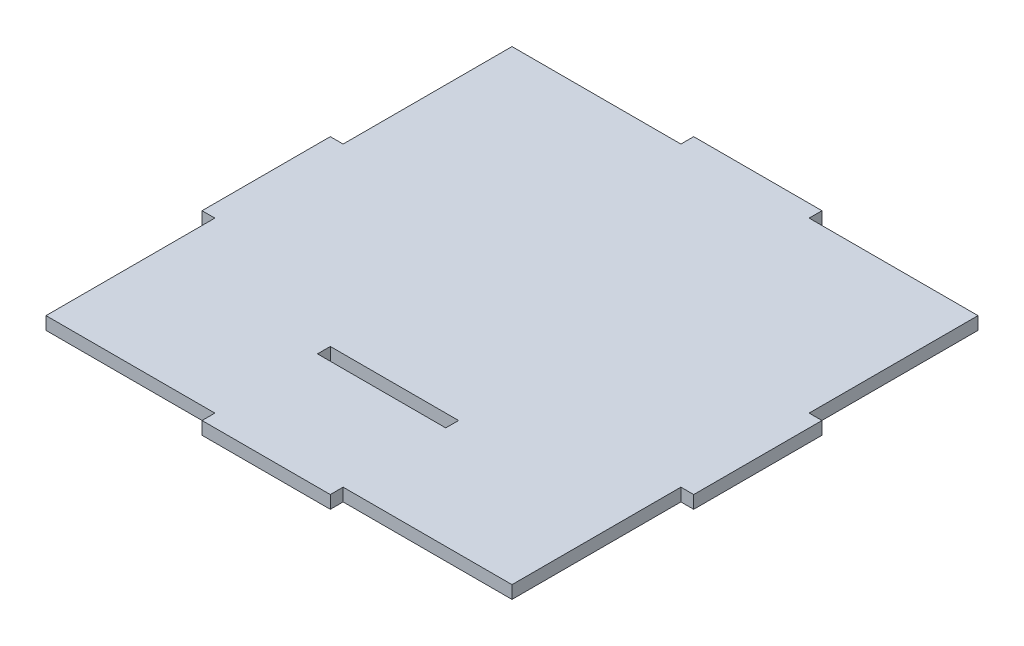
ISO-10303-21;
HEADER;
FILE_DESCRIPTION(('STEP AP214'),'2;1');
FILE_NAME('part.step','',(''),(''),'','','');
FILE_SCHEMA(('AUTOMOTIVE_DESIGN { 1 0 10303 214 1 1 1 1 }'));
ENDSEC;
DATA;
#1=APPLICATION_CONTEXT('core data for automotive mechanical design processes');
#2=APPLICATION_PROTOCOL_DEFINITION('international standard','automotive_design',2000,#1);
#3=PRODUCT_CONTEXT('',#1,'mechanical');
#4=PRODUCT('Part','Part','',(#3));
#5=PRODUCT_RELATED_PRODUCT_CATEGORY('part','',(#4));
#6=PRODUCT_DEFINITION_FORMATION('','',#4);
#7=PRODUCT_DEFINITION_CONTEXT('part definition',#1,'design');
#8=PRODUCT_DEFINITION('design','',#6,#7);
#9=PRODUCT_DEFINITION_SHAPE('','',#8);
#10=(LENGTH_UNIT() NAMED_UNIT(*) SI_UNIT(.MILLI.,.METRE.));
#11=(NAMED_UNIT(*) PLANE_ANGLE_UNIT() SI_UNIT($,.RADIAN.));
#12=(NAMED_UNIT(*) SI_UNIT($,.STERADIAN.) SOLID_ANGLE_UNIT());
#13=UNCERTAINTY_MEASURE_WITH_UNIT(LENGTH_MEASURE(1.E-05),#10,'distance_accuracy_value','');
#14=(GEOMETRIC_REPRESENTATION_CONTEXT(3) GLOBAL_UNCERTAINTY_ASSIGNED_CONTEXT((#13)) GLOBAL_UNIT_ASSIGNED_CONTEXT((#10,
#11,#12)) REPRESENTATION_CONTEXT('',''));
#15=CARTESIAN_POINT('',(0.,0.,0.));
#16=DIRECTION('',(0.,0.,1.));
#17=DIRECTION('',(1.,0.,0.));
#18=AXIS2_PLACEMENT_3D('',#15,#16,#17);
#19=CARTESIAN_POINT('',(14.9999999999994,3.,-1.73472347597673E-13));
#20=DIRECTION('',(1.,0.,0.));
#21=DIRECTION('',(0.,0.,-1.));
#22=AXIS2_PLACEMENT_3D('',#19,#20,#21);
#23=PLANE('',#22);
#24=DIRECTION('',(0.,0.,1.));
#25=VECTOR('',#24,1.);
#26=CARTESIAN_POINT('',(14.9999999999994,0.,-1.73472347597673E-13));
#27=LINE('',#26,#25);
#28=CARTESIAN_POINT('',(15.,0.,54.5));
#29=VERTEX_POINT('',#28);
#30=CARTESIAN_POINT('',(15.,0.,57.5));
#31=VERTEX_POINT('',#30);
#32=EDGE_CURVE('E225',#29,#31,#27,.T.);
#33=ORIENTED_EDGE('',*,*,#32,.F.);
#34=DIRECTION('',(0.,-1.,0.));
#35=VECTOR('',#34,1.);
#36=CARTESIAN_POINT('',(15.,3.,54.5));
#37=LINE('',#36,#35);
#38=CARTESIAN_POINT('',(15.,3.,54.5));
#39=VERTEX_POINT('',#38);
#40=EDGE_CURVE('E363',#39,#29,#37,.T.);
#41=ORIENTED_EDGE('',*,*,#40,.F.);
#42=DIRECTION('',(0.,0.,1.));
#43=VECTOR('',#42,1.);
#44=CARTESIAN_POINT('',(14.9999999999994,3.,-1.73472347597673E-13));
#45=LINE('',#44,#43);
#46=CARTESIAN_POINT('',(15.,3.,57.5));
#47=VERTEX_POINT('',#46);
#48=EDGE_CURVE('E228',#39,#47,#45,.T.);
#49=ORIENTED_EDGE('',*,*,#48,.T.);
#50=DIRECTION('',(0.,-1.,0.));
#51=VECTOR('',#50,1.);
#52=CARTESIAN_POINT('',(15.,3.,57.5));
#53=LINE('',#52,#51);
#54=EDGE_CURVE('E275',#47,#31,#53,.T.);
#55=ORIENTED_EDGE('',*,*,#54,.T.);
#56=EDGE_LOOP('',(#33,#41,#49,#55));
#57=FACE_BOUND('',#56,.T.);
#58=ADVANCED_FACE('F39',(#57),#23,.T.);
#59=CARTESIAN_POINT('',(0.,3.,54.5));
#60=DIRECTION('',(0.,0.,1.));
#61=DIRECTION('',(1.,0.,0.));
#62=AXIS2_PLACEMENT_3D('',#59,#60,#61);
#63=PLANE('',#62);
#64=DIRECTION('',(-1.,0.,0.));
#65=VECTOR('',#64,1.);
#66=CARTESIAN_POINT('',(0.,0.,54.5));
#67=LINE('',#66,#65);
#68=CARTESIAN_POINT('',(54.5,0.,54.5));
#69=VERTEX_POINT('',#68);
#70=EDGE_CURVE('E278',#69,#29,#67,.T.);
#71=ORIENTED_EDGE('',*,*,#70,.F.);
#72=DIRECTION('',(0.,-1.,0.));
#73=VECTOR('',#72,1.);
#74=CARTESIAN_POINT('',(54.5,3.,54.5));
#75=LINE('',#74,#73);
#76=CARTESIAN_POINT('',(54.5,3.,54.5));
#77=VERTEX_POINT('',#76);
#78=EDGE_CURVE('E361',#77,#69,#75,.T.);
#79=ORIENTED_EDGE('',*,*,#78,.F.);
#80=DIRECTION('',(-1.,0.,0.));
#81=VECTOR('',#80,1.);
#82=CARTESIAN_POINT('',(0.,3.,54.5));
#83=LINE('',#82,#81);
#84=EDGE_CURVE('E231',#77,#39,#83,.T.);
#85=ORIENTED_EDGE('',*,*,#84,.T.);
#86=ORIENTED_EDGE('',*,*,#40,.T.);
#87=EDGE_LOOP('',(#71,#79,#85,#86));
#88=FACE_BOUND('',#87,.T.);
#89=ADVANCED_FACE('F387',(#88),#63,.T.);
#90=CARTESIAN_POINT('',(54.5,3.,0.));
#91=DIRECTION('',(1.,0.,0.));
#92=DIRECTION('',(0.,0.,-1.));
#93=AXIS2_PLACEMENT_3D('',#90,#91,#92);
#94=PLANE('',#93);
#95=DIRECTION('',(0.,0.,1.));
#96=VECTOR('',#95,1.);
#97=CARTESIAN_POINT('',(54.5,0.,0.));
#98=LINE('',#97,#96);
#99=CARTESIAN_POINT('',(54.5,0.,15.));
#100=VERTEX_POINT('',#99);
#101=EDGE_CURVE('E281',#100,#69,#98,.T.);
#102=ORIENTED_EDGE('',*,*,#101,.F.);
#103=DIRECTION('',(0.,-1.,0.));
#104=VECTOR('',#103,1.);
#105=CARTESIAN_POINT('',(54.5,3.,15.));
#106=LINE('',#105,#104);
#107=CARTESIAN_POINT('',(54.5,3.,15.));
#108=VERTEX_POINT('',#107);
#109=EDGE_CURVE('E359',#108,#100,#106,.T.);
#110=ORIENTED_EDGE('',*,*,#109,.F.);
#111=DIRECTION('',(0.,0.,1.));
#112=VECTOR('',#111,1.);
#113=CARTESIAN_POINT('',(54.5,3.,0.));
#114=LINE('',#113,#112);
#115=EDGE_CURVE('E235',#108,#77,#114,.T.);
#116=ORIENTED_EDGE('',*,*,#115,.T.);
#117=ORIENTED_EDGE('',*,*,#78,.T.);
#118=EDGE_LOOP('',(#102,#110,#116,#117));
#119=FACE_BOUND('',#118,.T.);
#120=ADVANCED_FACE('F392',(#119),#94,.T.);
#121=CARTESIAN_POINT('',(0.,3.,15.));
#122=DIRECTION('',(0.,0.,-1.));
#123=DIRECTION('',(-1.,0.,0.));
#124=AXIS2_PLACEMENT_3D('',#121,#122,#123);
#125=PLANE('',#124);
#126=DIRECTION('',(1.,0.,0.));
#127=VECTOR('',#126,1.);
#128=CARTESIAN_POINT('',(0.,0.,15.));
#129=LINE('',#128,#127);
#130=CARTESIAN_POINT('',(57.5,0.,15.));
#131=VERTEX_POINT('',#130);
#132=EDGE_CURVE('E285',#100,#131,#129,.T.);
#133=ORIENTED_EDGE('',*,*,#132,.T.);
#134=DIRECTION('',(0.,-1.,0.));
#135=VECTOR('',#134,1.);
#136=CARTESIAN_POINT('',(57.5,3.,15.));
#137=LINE('',#136,#135);
#138=CARTESIAN_POINT('',(57.5,3.,15.));
#139=VERTEX_POINT('',#138);
#140=EDGE_CURVE('E357',#139,#131,#137,.T.);
#141=ORIENTED_EDGE('',*,*,#140,.F.);
#142=DIRECTION('',(1.,0.,0.));
#143=VECTOR('',#142,1.);
#144=CARTESIAN_POINT('',(0.,3.,15.));
#145=LINE('',#144,#143);
#146=EDGE_CURVE('E239',#108,#139,#145,.T.);
#147=ORIENTED_EDGE('',*,*,#146,.F.);
#148=ORIENTED_EDGE('',*,*,#109,.T.);
#149=EDGE_LOOP('',(#133,#141,#147,#148));
#150=FACE_BOUND('',#149,.T.);
#151=ADVANCED_FACE('F409',(#150),#125,.F.);
#152=CARTESIAN_POINT('',(57.5,3.,0.));
#153=DIRECTION('',(1.,0.,0.));
#154=DIRECTION('',(0.,0.,-1.));
#155=AXIS2_PLACEMENT_3D('',#152,#153,#154);
#156=PLANE('',#155);
#157=DIRECTION('',(0.,0.,1.));
#158=VECTOR('',#157,1.);
#159=CARTESIAN_POINT('',(57.5,0.,0.));
#160=LINE('',#159,#158);
#161=CARTESIAN_POINT('',(57.5,0.,-15.));
#162=VERTEX_POINT('',#161);
#163=EDGE_CURVE('E289',#162,#131,#160,.T.);
#164=ORIENTED_EDGE('',*,*,#163,.F.);
#165=DIRECTION('',(0.,-1.,0.));
#166=VECTOR('',#165,1.);
#167=CARTESIAN_POINT('',(57.5,3.,-15.));
#168=LINE('',#167,#166);
#169=CARTESIAN_POINT('',(57.5,3.,-15.));
#170=VERTEX_POINT('',#169);
#171=EDGE_CURVE('E355',#170,#162,#168,.T.);
#172=ORIENTED_EDGE('',*,*,#171,.F.);
#173=DIRECTION('',(0.,0.,1.));
#174=VECTOR('',#173,1.);
#175=CARTESIAN_POINT('',(57.5,3.,0.));
#176=LINE('',#175,#174);
#177=EDGE_CURVE('E242',#170,#139,#176,.T.);
#178=ORIENTED_EDGE('',*,*,#177,.T.);
#179=ORIENTED_EDGE('',*,*,#140,.T.);
#180=EDGE_LOOP('',(#164,#172,#178,#179));
#181=FACE_BOUND('',#180,.T.);
#182=ADVANCED_FACE('F416',(#181),#156,.T.);
#183=CARTESIAN_POINT('',(0.,3.,-15.));
#184=DIRECTION('',(0.,0.,1.));
#185=DIRECTION('',(1.,0.,0.));
#186=AXIS2_PLACEMENT_3D('',#183,#184,#185);
#187=PLANE('',#186);
#188=DIRECTION('',(-1.,0.,0.));
#189=VECTOR('',#188,1.);
#190=CARTESIAN_POINT('',(0.,0.,-15.));
#191=LINE('',#190,#189);
#192=CARTESIAN_POINT('',(54.5,0.,-15.));
#193=VERTEX_POINT('',#192);
#194=EDGE_CURVE('E292',#162,#193,#191,.T.);
#195=ORIENTED_EDGE('',*,*,#194,.T.);
#196=DIRECTION('',(0.,-1.,0.));
#197=VECTOR('',#196,1.);
#198=CARTESIAN_POINT('',(54.5,3.,-15.));
#199=LINE('',#198,#197);
#200=CARTESIAN_POINT('',(54.5,3.,-15.));
#201=VERTEX_POINT('',#200);
#202=EDGE_CURVE('E353',#201,#193,#199,.T.);
#203=ORIENTED_EDGE('',*,*,#202,.F.);
#204=DIRECTION('',(-1.,0.,0.));
#205=VECTOR('',#204,1.);
#206=CARTESIAN_POINT('',(0.,3.,-15.));
#207=LINE('',#206,#205);
#208=EDGE_CURVE('E245',#170,#201,#207,.T.);
#209=ORIENTED_EDGE('',*,*,#208,.F.);
#210=ORIENTED_EDGE('',*,*,#171,.T.);
#211=EDGE_LOOP('',(#195,#203,#209,#210));
#212=FACE_BOUND('',#211,.T.);
#213=ADVANCED_FACE('F419',(#212),#187,.F.);
#214=CARTESIAN_POINT('',(54.5,0.,-54.5));
#215=VERTEX_POINT('',#214);
#216=EDGE_CURVE('E286',#215,#193,#98,.T.);
#217=ORIENTED_EDGE('',*,*,#216,.F.);
#218=DIRECTION('',(0.,-1.,0.));
#219=VECTOR('',#218,1.);
#220=CARTESIAN_POINT('',(54.5,3.,-54.5));
#221=LINE('',#220,#219);
#222=CARTESIAN_POINT('',(54.5,3.,-54.5));
#223=VERTEX_POINT('',#222);
#224=EDGE_CURVE('E351',#223,#215,#221,.T.);
#225=ORIENTED_EDGE('',*,*,#224,.F.);
#226=EDGE_CURVE('E240',#223,#201,#114,.T.);
#227=ORIENTED_EDGE('',*,*,#226,.T.);
#228=ORIENTED_EDGE('',*,*,#202,.T.);
#229=EDGE_LOOP('',(#217,#225,#227,#228));
#230=FACE_BOUND('',#229,.T.);
#231=ADVANCED_FACE('F424',(#230),#94,.T.);
#232=CARTESIAN_POINT('',(0.,3.,-54.5));
#233=DIRECTION('',(0.,0.,-1.));
#234=DIRECTION('',(-1.,0.,0.));
#235=AXIS2_PLACEMENT_3D('',#232,#233,#234);
#236=PLANE('',#235);
#237=DIRECTION('',(1.,0.,0.));
#238=VECTOR('',#237,1.);
#239=CARTESIAN_POINT('',(0.,0.,-54.5));
#240=LINE('',#239,#238);
#241=CARTESIAN_POINT('',(15.,0.,-54.5));
#242=VERTEX_POINT('',#241);
#243=EDGE_CURVE('E295',#242,#215,#240,.T.);
#244=ORIENTED_EDGE('',*,*,#243,.F.);
#245=DIRECTION('',(0.,-1.,0.));
#246=VECTOR('',#245,1.);
#247=CARTESIAN_POINT('',(15.,3.,-54.5));
#248=LINE('',#247,#246);
#249=CARTESIAN_POINT('',(15.,3.,-54.5));
#250=VERTEX_POINT('',#249);
#251=EDGE_CURVE('E349',#250,#242,#248,.T.);
#252=ORIENTED_EDGE('',*,*,#251,.F.);
#253=DIRECTION('',(1.,0.,0.));
#254=VECTOR('',#253,1.);
#255=CARTESIAN_POINT('',(0.,3.,-54.5));
#256=LINE('',#255,#254);
#257=EDGE_CURVE('E247',#250,#223,#256,.T.);
#258=ORIENTED_EDGE('',*,*,#257,.T.);
#259=ORIENTED_EDGE('',*,*,#224,.T.);
#260=EDGE_LOOP('',(#244,#252,#258,#259));
#261=FACE_BOUND('',#260,.T.);
#262=ADVANCED_FACE('F428',(#261),#236,.T.);
#263=CARTESIAN_POINT('',(14.9999999999994,3.,1.73472347597673E-13));
#264=DIRECTION('',(-1.,0.,0.));
#265=DIRECTION('',(0.,0.,1.));
#266=AXIS2_PLACEMENT_3D('',#263,#264,#265);
#267=PLANE('',#266);
#268=DIRECTION('',(0.,0.,-1.));
#269=VECTOR('',#268,1.);
#270=CARTESIAN_POINT('',(14.9999999999994,0.,1.73472347597673E-13));
#271=LINE('',#270,#269);
#272=CARTESIAN_POINT('',(15.,0.,-57.5));
#273=VERTEX_POINT('',#272);
#274=EDGE_CURVE('E298',#242,#273,#271,.T.);
#275=ORIENTED_EDGE('',*,*,#274,.T.);
#276=DIRECTION('',(0.,-1.,0.));
#277=VECTOR('',#276,1.);
#278=CARTESIAN_POINT('',(15.,3.,-57.5));
#279=LINE('',#278,#277);
#280=CARTESIAN_POINT('',(15.,3.,-57.5));
#281=VERTEX_POINT('',#280);
#282=EDGE_CURVE('E346',#281,#273,#279,.T.);
#283=ORIENTED_EDGE('',*,*,#282,.F.);
#284=DIRECTION('',(0.,0.,-1.));
#285=VECTOR('',#284,1.);
#286=CARTESIAN_POINT('',(14.9999999999994,3.,1.73472347597673E-13));
#287=LINE('',#286,#285);
#288=EDGE_CURVE('E250',#250,#281,#287,.T.);
#289=ORIENTED_EDGE('',*,*,#288,.F.);
#290=ORIENTED_EDGE('',*,*,#251,.T.);
#291=EDGE_LOOP('',(#275,#283,#289,#290));
#292=FACE_BOUND('',#291,.T.);
#293=ADVANCED_FACE('F433',(#292),#267,.F.);
#294=CARTESIAN_POINT('',(0.,3.,-57.5));
#295=DIRECTION('',(0.,0.,1.));
#296=DIRECTION('',(1.,0.,0.));
#297=AXIS2_PLACEMENT_3D('',#294,#295,#296);
#298=PLANE('',#297);
#299=DIRECTION('',(-1.,0.,0.));
#300=VECTOR('',#299,1.);
#301=CARTESIAN_POINT('',(0.,0.,-57.5));
#302=LINE('',#301,#300);
#303=CARTESIAN_POINT('',(-15.,0.,-57.5));
#304=VERTEX_POINT('',#303);
#305=EDGE_CURVE('E301',#273,#304,#302,.T.);
#306=ORIENTED_EDGE('',*,*,#305,.T.);
#307=DIRECTION('',(0.,-1.,0.));
#308=VECTOR('',#307,1.);
#309=CARTESIAN_POINT('',(-15.,3.,-57.5));
#310=LINE('',#309,#308);
#311=CARTESIAN_POINT('',(-15.,3.,-57.5));
#312=VERTEX_POINT('',#311);
#313=EDGE_CURVE('E343',#312,#304,#310,.T.);
#314=ORIENTED_EDGE('',*,*,#313,.F.);
#315=DIRECTION('',(-1.,0.,0.));
#316=VECTOR('',#315,1.);
#317=CARTESIAN_POINT('',(0.,3.,-57.5));
#318=LINE('',#317,#316);
#319=EDGE_CURVE('E253',#281,#312,#318,.T.);
#320=ORIENTED_EDGE('',*,*,#319,.F.);
#321=ORIENTED_EDGE('',*,*,#282,.T.);
#322=EDGE_LOOP('',(#306,#314,#320,#321));
#323=FACE_BOUND('',#322,.T.);
#324=ADVANCED_FACE('F440',(#323),#298,.F.);
#325=CARTESIAN_POINT('',(-14.9999999999996,3.,1.04083408558606E-13));
#326=DIRECTION('',(1.,0.,0.));
#327=DIRECTION('',(0.,0.,-1.));
#328=AXIS2_PLACEMENT_3D('',#325,#326,#327);
#329=PLANE('',#328);
#330=DIRECTION('',(0.,0.,1.));
#331=VECTOR('',#330,1.);
#332=CARTESIAN_POINT('',(-14.9999999999996,0.,1.04083408558606E-13));
#333=LINE('',#332,#331);
#334=CARTESIAN_POINT('',(-15.,0.,-54.5));
#335=VERTEX_POINT('',#334);
#336=EDGE_CURVE('E303',#304,#335,#333,.T.);
#337=ORIENTED_EDGE('',*,*,#336,.T.);
#338=DIRECTION('',(0.,-1.,0.));
#339=VECTOR('',#338,1.);
#340=CARTESIAN_POINT('',(-15.,3.,-54.5));
#341=LINE('',#340,#339);
#342=CARTESIAN_POINT('',(-15.,3.,-54.5));
#343=VERTEX_POINT('',#342);
#344=EDGE_CURVE('E341',#343,#335,#341,.T.);
#345=ORIENTED_EDGE('',*,*,#344,.F.);
#346=DIRECTION('',(0.,0.,1.));
#347=VECTOR('',#346,1.);
#348=CARTESIAN_POINT('',(-14.9999999999996,3.,1.04083408558606E-13));
#349=LINE('',#348,#347);
#350=EDGE_CURVE('E255',#312,#343,#349,.T.);
#351=ORIENTED_EDGE('',*,*,#350,.F.);
#352=ORIENTED_EDGE('',*,*,#313,.T.);
#353=EDGE_LOOP('',(#337,#345,#351,#352));
#354=FACE_BOUND('',#353,.T.);
#355=ADVANCED_FACE('F444',(#354),#329,.F.);
#356=CARTESIAN_POINT('',(-54.5,0.,-54.5));
#357=VERTEX_POINT('',#356);
#358=EDGE_CURVE('E299',#357,#335,#240,.T.);
#359=ORIENTED_EDGE('',*,*,#358,.F.);
#360=DIRECTION('',(0.,-1.,0.));
#361=VECTOR('',#360,1.);
#362=CARTESIAN_POINT('',(-54.5,3.,-54.5));
#363=LINE('',#362,#361);
#364=CARTESIAN_POINT('',(-54.5,3.,-54.5));
#365=VERTEX_POINT('',#364);
#366=EDGE_CURVE('E339',#365,#357,#363,.T.);
#367=ORIENTED_EDGE('',*,*,#366,.F.);
#368=EDGE_CURVE('E251',#365,#343,#256,.T.);
#369=ORIENTED_EDGE('',*,*,#368,.T.);
#370=ORIENTED_EDGE('',*,*,#344,.T.);
#371=EDGE_LOOP('',(#359,#367,#369,#370));
#372=FACE_BOUND('',#371,.T.);
#373=ADVANCED_FACE('F449',(#372),#236,.T.);
#374=CARTESIAN_POINT('',(-54.5,3.,0.));
#375=DIRECTION('',(-1.,0.,0.));
#376=DIRECTION('',(0.,0.,1.));
#377=AXIS2_PLACEMENT_3D('',#374,#375,#376);
#378=PLANE('',#377);
#379=DIRECTION('',(0.,0.,-1.));
#380=VECTOR('',#379,1.);
#381=CARTESIAN_POINT('',(-54.5,0.,0.));
#382=LINE('',#381,#380);
#383=CARTESIAN_POINT('',(-54.5,0.,-15.));
#384=VERTEX_POINT('',#383);
#385=EDGE_CURVE('E306',#384,#357,#382,.T.);
#386=ORIENTED_EDGE('',*,*,#385,.F.);
#387=DIRECTION('',(0.,-1.,0.));
#388=VECTOR('',#387,1.);
#389=CARTESIAN_POINT('',(-54.5,3.,-15.));
#390=LINE('',#389,#388);
#391=CARTESIAN_POINT('',(-54.5,3.,-15.));
#392=VERTEX_POINT('',#391);
#393=EDGE_CURVE('E337',#392,#384,#390,.T.);
#394=ORIENTED_EDGE('',*,*,#393,.F.);
#395=DIRECTION('',(0.,0.,-1.));
#396=VECTOR('',#395,1.);
#397=CARTESIAN_POINT('',(-54.5,3.,0.));
#398=LINE('',#397,#396);
#399=EDGE_CURVE('E257',#392,#365,#398,.T.);
#400=ORIENTED_EDGE('',*,*,#399,.T.);
#401=ORIENTED_EDGE('',*,*,#366,.T.);
#402=EDGE_LOOP('',(#386,#394,#400,#401));
#403=FACE_BOUND('',#402,.T.);
#404=ADVANCED_FACE('F454',(#403),#378,.T.);
#405=CARTESIAN_POINT('',(0.,3.,-15.));
#406=DIRECTION('',(0.,0.,-1.));
#407=DIRECTION('',(-1.,0.,0.));
#408=AXIS2_PLACEMENT_3D('',#405,#406,#407);
#409=PLANE('',#408);
#410=DIRECTION('',(1.,0.,0.));
#411=VECTOR('',#410,1.);
#412=CARTESIAN_POINT('',(0.,0.,-15.));
#413=LINE('',#412,#411);
#414=CARTESIAN_POINT('',(-57.5,0.,-15.));
#415=VERTEX_POINT('',#414);
#416=EDGE_CURVE('E309',#415,#384,#413,.T.);
#417=ORIENTED_EDGE('',*,*,#416,.F.);
#418=DIRECTION('',(0.,-1.,0.));
#419=VECTOR('',#418,1.);
#420=CARTESIAN_POINT('',(-57.5,3.,-15.));
#421=LINE('',#420,#419);
#422=CARTESIAN_POINT('',(-57.5,3.,-15.));
#423=VERTEX_POINT('',#422);
#424=EDGE_CURVE('E335',#423,#415,#421,.T.);
#425=ORIENTED_EDGE('',*,*,#424,.F.);
#426=DIRECTION('',(1.,0.,0.));
#427=VECTOR('',#426,1.);
#428=CARTESIAN_POINT('',(0.,3.,-15.));
#429=LINE('',#428,#427);
#430=EDGE_CURVE('E260',#423,#392,#429,.T.);
#431=ORIENTED_EDGE('',*,*,#430,.T.);
#432=ORIENTED_EDGE('',*,*,#393,.T.);
#433=EDGE_LOOP('',(#417,#425,#431,#432));
#434=FACE_BOUND('',#433,.T.);
#435=ADVANCED_FACE('F457',(#434),#409,.T.);
#436=CARTESIAN_POINT('',(-57.5,3.,0.));
#437=DIRECTION('',(1.,0.,0.));
#438=DIRECTION('',(0.,0.,-1.));
#439=AXIS2_PLACEMENT_3D('',#436,#437,#438);
#440=PLANE('',#439);
#441=DIRECTION('',(0.,0.,1.));
#442=VECTOR('',#441,1.);
#443=CARTESIAN_POINT('',(-57.5,0.,0.));
#444=LINE('',#443,#442);
#445=CARTESIAN_POINT('',(-57.5,0.,15.));
#446=VERTEX_POINT('',#445);
#447=EDGE_CURVE('E313',#415,#446,#444,.T.);
#448=ORIENTED_EDGE('',*,*,#447,.T.);
#449=DIRECTION('',(0.,-1.,0.));
#450=VECTOR('',#449,1.);
#451=CARTESIAN_POINT('',(-57.5,3.,15.));
#452=LINE('',#451,#450);
#453=CARTESIAN_POINT('',(-57.5,3.,15.));
#454=VERTEX_POINT('',#453);
#455=EDGE_CURVE('E333',#454,#446,#452,.T.);
#456=ORIENTED_EDGE('',*,*,#455,.F.);
#457=DIRECTION('',(0.,0.,1.));
#458=VECTOR('',#457,1.);
#459=CARTESIAN_POINT('',(-57.5,3.,0.));
#460=LINE('',#459,#458);
#461=EDGE_CURVE('E264',#423,#454,#460,.T.);
#462=ORIENTED_EDGE('',*,*,#461,.F.);
#463=ORIENTED_EDGE('',*,*,#424,.T.);
#464=EDGE_LOOP('',(#448,#456,#462,#463));
#465=FACE_BOUND('',#464,.T.);
#466=ADVANCED_FACE('F464',(#465),#440,.F.);
#467=CARTESIAN_POINT('',(1.38777878078138E-13,3.,14.9999999999995));
#468=DIRECTION('',(0.,0.,1.));
#469=DIRECTION('',(1.,0.,0.));
#470=AXIS2_PLACEMENT_3D('',#467,#468,#469);
#471=PLANE('',#470);
#472=DIRECTION('',(-1.,0.,0.));
#473=VECTOR('',#472,1.);
#474=CARTESIAN_POINT('',(1.38777878078138E-13,0.,14.9999999999995));
#475=LINE('',#474,#473);
#476=CARTESIAN_POINT('',(-54.5,0.,15.));
#477=VERTEX_POINT('',#476);
#478=EDGE_CURVE('E316',#477,#446,#475,.T.);
#479=ORIENTED_EDGE('',*,*,#478,.F.);
#480=DIRECTION('',(0.,-1.,0.));
#481=VECTOR('',#480,1.);
#482=CARTESIAN_POINT('',(-54.5,3.,15.));
#483=LINE('',#482,#481);
#484=CARTESIAN_POINT('',(-54.5,3.,15.));
#485=VERTEX_POINT('',#484);
#486=EDGE_CURVE('E331',#485,#477,#483,.T.);
#487=ORIENTED_EDGE('',*,*,#486,.F.);
#488=DIRECTION('',(-1.,0.,0.));
#489=VECTOR('',#488,1.);
#490=CARTESIAN_POINT('',(1.38777878078138E-13,3.,14.9999999999995));
#491=LINE('',#490,#489);
#492=EDGE_CURVE('E266',#485,#454,#491,.T.);
#493=ORIENTED_EDGE('',*,*,#492,.T.);
#494=ORIENTED_EDGE('',*,*,#455,.T.);
#495=EDGE_LOOP('',(#479,#487,#493,#494));
#496=FACE_BOUND('',#495,.T.);
#497=ADVANCED_FACE('F468',(#496),#471,.T.);
#498=CARTESIAN_POINT('',(-54.5,0.,54.5));
#499=VERTEX_POINT('',#498);
#500=EDGE_CURVE('E310',#499,#477,#382,.T.);
#501=ORIENTED_EDGE('',*,*,#500,.F.);
#502=DIRECTION('',(0.,-1.,0.));
#503=VECTOR('',#502,1.);
#504=CARTESIAN_POINT('',(-54.5,3.,54.5));
#505=LINE('',#504,#503);
#506=CARTESIAN_POINT('',(-54.5,3.,54.5));
#507=VERTEX_POINT('',#506);
#508=EDGE_CURVE('E329',#507,#499,#505,.T.);
#509=ORIENTED_EDGE('',*,*,#508,.F.);
#510=EDGE_CURVE('E261',#507,#485,#398,.T.);
#511=ORIENTED_EDGE('',*,*,#510,.T.);
#512=ORIENTED_EDGE('',*,*,#486,.T.);
#513=EDGE_LOOP('',(#501,#509,#511,#512));
#514=FACE_BOUND('',#513,.T.);
#515=ADVANCED_FACE('F472',(#514),#378,.T.);
#516=CARTESIAN_POINT('',(-15.,0.,54.5));
#517=VERTEX_POINT('',#516);
#518=EDGE_CURVE('E282',#517,#499,#67,.T.);
#519=ORIENTED_EDGE('',*,*,#518,.F.);
#520=DIRECTION('',(0.,-1.,0.));
#521=VECTOR('',#520,1.);
#522=CARTESIAN_POINT('',(-15.,3.,54.5));
#523=LINE('',#522,#521);
#524=CARTESIAN_POINT('',(-15.,3.,54.5));
#525=VERTEX_POINT('',#524);
#526=EDGE_CURVE('E327',#525,#517,#523,.T.);
#527=ORIENTED_EDGE('',*,*,#526,.F.);
#528=EDGE_CURVE('E236',#525,#507,#83,.T.);
#529=ORIENTED_EDGE('',*,*,#528,.T.);
#530=ORIENTED_EDGE('',*,*,#508,.T.);
#531=EDGE_LOOP('',(#519,#527,#529,#530));
#532=FACE_BOUND('',#531,.T.);
#533=ADVANCED_FACE('F395',(#532),#63,.T.);
#534=CARTESIAN_POINT('',(-14.9999999999988,3.,-3.12250225675802E-13));
#535=DIRECTION('',(-1.,0.,0.));
#536=DIRECTION('',(0.,0.,1.));
#537=AXIS2_PLACEMENT_3D('',#534,#535,#536);
#538=PLANE('',#537);
#539=DIRECTION('',(0.,0.,-1.));
#540=VECTOR('',#539,1.);
#541=CARTESIAN_POINT('',(-14.9999999999988,0.,-3.12250225675802E-13));
#542=LINE('',#541,#540);
#543=CARTESIAN_POINT('',(-15.,0.,57.5));
#544=VERTEX_POINT('',#543);
#545=EDGE_CURVE('E319',#544,#517,#542,.T.);
#546=ORIENTED_EDGE('',*,*,#545,.F.);
#547=DIRECTION('',(0.,-1.,0.));
#548=VECTOR('',#547,1.);
#549=CARTESIAN_POINT('',(-15.,3.,57.5));
#550=LINE('',#549,#548);
#551=CARTESIAN_POINT('',(-15.,3.,57.5));
#552=VERTEX_POINT('',#551);
#553=EDGE_CURVE('E325',#552,#544,#550,.T.);
#554=ORIENTED_EDGE('',*,*,#553,.F.);
#555=DIRECTION('',(0.,0.,-1.));
#556=VECTOR('',#555,1.);
#557=CARTESIAN_POINT('',(-14.9999999999988,3.,-3.12250225675802E-13));
#558=LINE('',#557,#556);
#559=EDGE_CURVE('E269',#552,#525,#558,.T.);
#560=ORIENTED_EDGE('',*,*,#559,.T.);
#561=ORIENTED_EDGE('',*,*,#526,.T.);
#562=EDGE_LOOP('',(#546,#554,#560,#561));
#563=FACE_BOUND('',#562,.T.);
#564=ADVANCED_FACE('F481',(#563),#538,.T.);
#565=CARTESIAN_POINT('',(0.,3.,57.5));
#566=DIRECTION('',(0.,0.,1.));
#567=DIRECTION('',(1.,0.,0.));
#568=AXIS2_PLACEMENT_3D('',#565,#566,#567);
#569=PLANE('',#568);
#570=DIRECTION('',(-1.,0.,0.));
#571=VECTOR('',#570,1.);
#572=CARTESIAN_POINT('',(0.,0.,57.5));
#573=LINE('',#572,#571);
#574=EDGE_CURVE('E232',#31,#544,#573,.T.);
#575=ORIENTED_EDGE('',*,*,#574,.F.);
#576=ORIENTED_EDGE('',*,*,#54,.F.);
#577=DIRECTION('',(-1.,0.,0.));
#578=VECTOR('',#577,1.);
#579=CARTESIAN_POINT('',(0.,3.,57.5));
#580=LINE('',#579,#578);
#581=EDGE_CURVE('E272',#47,#552,#580,.T.);
#582=ORIENTED_EDGE('',*,*,#581,.T.);
#583=ORIENTED_EDGE('',*,*,#553,.T.);
#584=EDGE_LOOP('',(#575,#576,#582,#583));
#585=FACE_BOUND('',#584,.T.);
#586=ADVANCED_FACE('F483',(#585),#569,.T.);
#587=CARTESIAN_POINT('',(0.,3.,0.));
#588=DIRECTION('',(0.,1.,0.));
#589=DIRECTION('',(0.,0.,1.));
#590=AXIS2_PLACEMENT_3D('',#587,#588,#589);
#591=PLANE('',#590);
#592=DIRECTION('',(0.,0.,1.));
#593=VECTOR('',#592,1.);
#594=CARTESIAN_POINT('',(-15.,3.,30.5));
#595=LINE('',#594,#593);
#596=CARTESIAN_POINT('',(-15.,3.,27.5));
#597=VERTEX_POINT('',#596);
#598=CARTESIAN_POINT('',(-15.,3.,30.5));
#599=VERTEX_POINT('',#598);
#600=EDGE_CURVE('E53',#597,#599,#595,.T.);
#601=ORIENTED_EDGE('',*,*,#600,.F.);
#602=DIRECTION('',(-1.,0.,0.));
#603=VECTOR('',#602,1.);
#604=CARTESIAN_POINT('',(-15.,3.,27.5));
#605=LINE('',#604,#603);
#606=CARTESIAN_POINT('',(15.,3.,27.5));
#607=VERTEX_POINT('',#606);
#608=EDGE_CURVE('E218',#607,#597,#605,.T.);
#609=ORIENTED_EDGE('',*,*,#608,.F.);
#610=DIRECTION('',(0.,0.,-1.));
#611=VECTOR('',#610,1.);
#612=CARTESIAN_POINT('',(15.,3.,30.5));
#613=LINE('',#612,#611);
#614=CARTESIAN_POINT('',(15.,3.,30.5));
#615=VERTEX_POINT('',#614);
#616=EDGE_CURVE('E202',#615,#607,#613,.T.);
#617=ORIENTED_EDGE('',*,*,#616,.F.);
#618=DIRECTION('',(1.,0.,0.));
#619=VECTOR('',#618,1.);
#620=CARTESIAN_POINT('',(-15.,3.,30.5));
#621=LINE('',#620,#619);
#622=EDGE_CURVE('E211',#599,#615,#621,.T.);
#623=ORIENTED_EDGE('',*,*,#622,.F.);
#624=EDGE_LOOP('',(#601,#609,#617,#623));
#625=FACE_BOUND('',#624,.T.);
#626=ORIENTED_EDGE('',*,*,#48,.F.);
#627=ORIENTED_EDGE('',*,*,#84,.F.);
#628=ORIENTED_EDGE('',*,*,#115,.F.);
#629=ORIENTED_EDGE('',*,*,#146,.T.);
#630=ORIENTED_EDGE('',*,*,#177,.F.);
#631=ORIENTED_EDGE('',*,*,#208,.T.);
#632=ORIENTED_EDGE('',*,*,#226,.F.);
#633=ORIENTED_EDGE('',*,*,#257,.F.);
#634=ORIENTED_EDGE('',*,*,#288,.T.);
#635=ORIENTED_EDGE('',*,*,#319,.T.);
#636=ORIENTED_EDGE('',*,*,#350,.T.);
#637=ORIENTED_EDGE('',*,*,#368,.F.);
#638=ORIENTED_EDGE('',*,*,#399,.F.);
#639=ORIENTED_EDGE('',*,*,#430,.F.);
#640=ORIENTED_EDGE('',*,*,#461,.T.);
#641=ORIENTED_EDGE('',*,*,#492,.F.);
#642=ORIENTED_EDGE('',*,*,#510,.F.);
#643=ORIENTED_EDGE('',*,*,#528,.F.);
#644=ORIENTED_EDGE('',*,*,#559,.F.);
#645=ORIENTED_EDGE('',*,*,#581,.F.);
#646=EDGE_LOOP('',(#626,#627,#628,#629,#630,#631,#632,#633,#634,#635,#636,#637,#638,#639,#640,
#641,#642,#643,#644,#645));
#647=FACE_BOUND('',#646,.T.);
#648=ADVANCED_FACE('F215',(#625,#647),#591,.T.);
#649=CARTESIAN_POINT('',(0.,0.,0.));
#650=DIRECTION('',(0.,1.,0.));
#651=DIRECTION('',(0.,0.,1.));
#652=AXIS2_PLACEMENT_3D('',#649,#650,#651);
#653=PLANE('',#652);
#654=DIRECTION('',(-1.,0.,0.));
#655=VECTOR('',#654,1.);
#656=CARTESIAN_POINT('',(0.,0.,27.5));
#657=LINE('',#656,#655);
#658=CARTESIAN_POINT('',(15.,0.,27.5));
#659=VERTEX_POINT('',#658);
#660=CARTESIAN_POINT('',(-15.,0.,27.5));
#661=VERTEX_POINT('',#660);
#662=EDGE_CURVE('E46',#659,#661,#657,.T.);
#663=ORIENTED_EDGE('',*,*,#662,.T.);
#664=DIRECTION('',(0.,0.,1.));
#665=VECTOR('',#664,1.);
#666=CARTESIAN_POINT('',(-15.,0.,0.));
#667=LINE('',#666,#665);
#668=CARTESIAN_POINT('',(-15.,0.,30.5));
#669=VERTEX_POINT('',#668);
#670=EDGE_CURVE('E11',#661,#669,#667,.T.);
#671=ORIENTED_EDGE('',*,*,#670,.T.);
#672=DIRECTION('',(1.,0.,0.));
#673=VECTOR('',#672,1.);
#674=CARTESIAN_POINT('',(0.,0.,30.5));
#675=LINE('',#674,#673);
#676=CARTESIAN_POINT('',(15.,0.,30.5));
#677=VERTEX_POINT('',#676);
#678=EDGE_CURVE('E365',#669,#677,#675,.T.);
#679=ORIENTED_EDGE('',*,*,#678,.T.);
#680=DIRECTION('',(0.,0.,-1.));
#681=VECTOR('',#680,1.);
#682=CARTESIAN_POINT('',(15.,0.,0.));
#683=LINE('',#682,#681);
#684=EDGE_CURVE('E205',#677,#659,#683,.T.);
#685=ORIENTED_EDGE('',*,*,#684,.T.);
#686=EDGE_LOOP('',(#663,#671,#679,#685));
#687=FACE_BOUND('',#686,.T.);
#688=ORIENTED_EDGE('',*,*,#32,.T.);
#689=ORIENTED_EDGE('',*,*,#574,.T.);
#690=ORIENTED_EDGE('',*,*,#545,.T.);
#691=ORIENTED_EDGE('',*,*,#518,.T.);
#692=ORIENTED_EDGE('',*,*,#500,.T.);
#693=ORIENTED_EDGE('',*,*,#478,.T.);
#694=ORIENTED_EDGE('',*,*,#447,.F.);
#695=ORIENTED_EDGE('',*,*,#416,.T.);
#696=ORIENTED_EDGE('',*,*,#385,.T.);
#697=ORIENTED_EDGE('',*,*,#358,.T.);
#698=ORIENTED_EDGE('',*,*,#336,.F.);
#699=ORIENTED_EDGE('',*,*,#305,.F.);
#700=ORIENTED_EDGE('',*,*,#274,.F.);
#701=ORIENTED_EDGE('',*,*,#243,.T.);
#702=ORIENTED_EDGE('',*,*,#216,.T.);
#703=ORIENTED_EDGE('',*,*,#194,.F.);
#704=ORIENTED_EDGE('',*,*,#163,.T.);
#705=ORIENTED_EDGE('',*,*,#132,.F.);
#706=ORIENTED_EDGE('',*,*,#101,.T.);
#707=ORIENTED_EDGE('',*,*,#70,.T.);
#708=EDGE_LOOP('',(#688,#689,#690,#691,#692,#693,#694,#695,#696,#697,#698,#699,#700,#701,#702,
#703,#704,#705,#706,#707));
#709=FACE_BOUND('',#708,.T.);
#710=ADVANCED_FACE('F369',(#687,#709),#653,.F.);
#711=CARTESIAN_POINT('',(-15.,-7.,30.5));
#712=DIRECTION('',(-1.,0.,0.));
#713=DIRECTION('',(0.,0.,1.));
#714=AXIS2_PLACEMENT_3D('',#711,#712,#713);
#715=PLANE('',#714);
#716=DIRECTION('',(0.,1.,0.));
#717=VECTOR('',#716,1.);
#718=CARTESIAN_POINT('',(-15.,-7.,27.5));
#719=LINE('',#718,#717);
#720=EDGE_CURVE('E223',#661,#597,#719,.T.);
#721=ORIENTED_EDGE('',*,*,#720,.T.);
#722=ORIENTED_EDGE('',*,*,#600,.T.);
#723=DIRECTION('',(0.,1.,0.));
#724=VECTOR('',#723,1.);
#725=CARTESIAN_POINT('',(-15.,-7.,30.5));
#726=LINE('',#725,#724);
#727=EDGE_CURVE('E208',#669,#599,#726,.T.);
#728=ORIENTED_EDGE('',*,*,#727,.F.);
#729=ORIENTED_EDGE('',*,*,#670,.F.);
#730=EDGE_LOOP('',(#721,#722,#728,#729));
#731=FACE_BOUND('',#730,.T.);
#732=ADVANCED_FACE('F374',(#731),#715,.F.);
#733=CARTESIAN_POINT('',(-15.,-7.,27.5));
#734=DIRECTION('',(0.,0.,-1.));
#735=DIRECTION('',(-1.,0.,0.));
#736=AXIS2_PLACEMENT_3D('',#733,#734,#735);
#737=PLANE('',#736);
#738=DIRECTION('',(0.,1.,0.));
#739=VECTOR('',#738,1.);
#740=CARTESIAN_POINT('',(15.,-7.,27.5));
#741=LINE('',#740,#739);
#742=EDGE_CURVE('E207',#659,#607,#741,.T.);
#743=ORIENTED_EDGE('',*,*,#742,.T.);
#744=ORIENTED_EDGE('',*,*,#608,.T.);
#745=ORIENTED_EDGE('',*,*,#720,.F.);
#746=ORIENTED_EDGE('',*,*,#662,.F.);
#747=EDGE_LOOP('',(#743,#744,#745,#746));
#748=FACE_BOUND('',#747,.T.);
#749=ADVANCED_FACE('F373',(#748),#737,.F.);
#750=CARTESIAN_POINT('',(15.,-7.,30.5));
#751=DIRECTION('',(1.,0.,0.));
#752=DIRECTION('',(0.,0.,-1.));
#753=AXIS2_PLACEMENT_3D('',#750,#751,#752);
#754=PLANE('',#753);
#755=DIRECTION('',(0.,1.,0.));
#756=VECTOR('',#755,1.);
#757=CARTESIAN_POINT('',(15.,-7.,30.5));
#758=LINE('',#757,#756);
#759=EDGE_CURVE('E61',#677,#615,#758,.T.);
#760=ORIENTED_EDGE('',*,*,#759,.T.);
#761=ORIENTED_EDGE('',*,*,#616,.T.);
#762=ORIENTED_EDGE('',*,*,#742,.F.);
#763=ORIENTED_EDGE('',*,*,#684,.F.);
#764=EDGE_LOOP('',(#760,#761,#762,#763));
#765=FACE_BOUND('',#764,.T.);
#766=ADVANCED_FACE('F199',(#765),#754,.F.);
#767=CARTESIAN_POINT('',(-15.,-7.,30.5));
#768=DIRECTION('',(0.,0.,1.));
#769=DIRECTION('',(1.,0.,0.));
#770=AXIS2_PLACEMENT_3D('',#767,#768,#769);
#771=PLANE('',#770);
#772=ORIENTED_EDGE('',*,*,#727,.T.);
#773=ORIENTED_EDGE('',*,*,#622,.T.);
#774=ORIENTED_EDGE('',*,*,#759,.F.);
#775=ORIENTED_EDGE('',*,*,#678,.F.);
#776=EDGE_LOOP('',(#772,#773,#774,#775));
#777=FACE_BOUND('',#776,.T.);
#778=ADVANCED_FACE('F212',(#777),#771,.F.);
#779=CLOSED_SHELL('',(#58,#89,#120,#151,#182,#213,#231,#262,#293,#324,#355,#373,#404,#435,#466,
#497,#515,#533,#564,#586,#648,#710,#732,#749,#766,#778));
#780=MANIFOLD_SOLID_BREP('B2',#779);
#781=ADVANCED_BREP_SHAPE_REPRESENTATION('',(#18,#780),#14);
#782=SHAPE_DEFINITION_REPRESENTATION(#9,#781);
ENDSEC;
END-ISO-10303-21;
